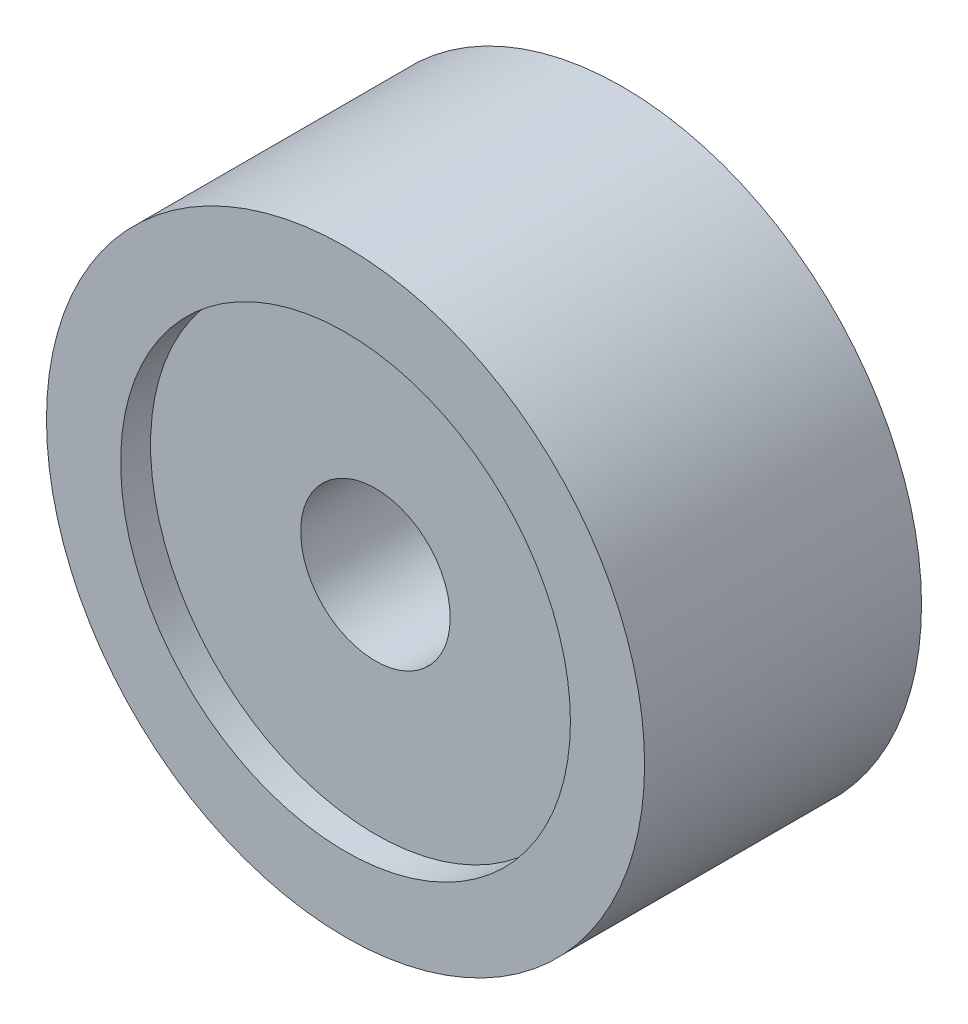
ISO-10303-21;
HEADER;
FILE_DESCRIPTION(('STEP AP214'),'2;1');
FILE_NAME('part.step','',(''),(''),'','','');
FILE_SCHEMA(('AUTOMOTIVE_DESIGN { 1 0 10303 214 1 1 1 1 }'));
ENDSEC;
DATA;
#1=APPLICATION_CONTEXT('core data for automotive mechanical design processes');
#2=APPLICATION_PROTOCOL_DEFINITION('international standard','automotive_design',2000,#1);
#3=PRODUCT_CONTEXT('',#1,'mechanical');
#4=PRODUCT('Part','Part','',(#3));
#5=PRODUCT_RELATED_PRODUCT_CATEGORY('part','',(#4));
#6=PRODUCT_DEFINITION_FORMATION('','',#4);
#7=PRODUCT_DEFINITION_CONTEXT('part definition',#1,'design');
#8=PRODUCT_DEFINITION('design','',#6,#7);
#9=PRODUCT_DEFINITION_SHAPE('','',#8);
#10=(LENGTH_UNIT() NAMED_UNIT(*) SI_UNIT(.MILLI.,.METRE.));
#11=(NAMED_UNIT(*) PLANE_ANGLE_UNIT() SI_UNIT($,.RADIAN.));
#12=(NAMED_UNIT(*) SI_UNIT($,.STERADIAN.) SOLID_ANGLE_UNIT());
#13=UNCERTAINTY_MEASURE_WITH_UNIT(LENGTH_MEASURE(1.E-05),#10,'distance_accuracy_value','');
#14=(GEOMETRIC_REPRESENTATION_CONTEXT(3) GLOBAL_UNCERTAINTY_ASSIGNED_CONTEXT((#13)) GLOBAL_UNIT_ASSIGNED_CONTEXT((#10,
#11,#12)) REPRESENTATION_CONTEXT('',''));
#15=CARTESIAN_POINT('',(0.,0.,0.));
#16=DIRECTION('',(0.,0.,1.));
#17=DIRECTION('',(1.,0.,0.));
#18=AXIS2_PLACEMENT_3D('',#15,#16,#17);
#19=CARTESIAN_POINT('',(0.,0.,-11.7602));
#20=DIRECTION('',(0.,0.,1.));
#21=DIRECTION('',(1.,0.,0.));
#22=AXIS2_PLACEMENT_3D('',#19,#20,#21);
#23=CYLINDRICAL_SURFACE('',#22,3.175);
#24=CARTESIAN_POINT('',(0.,0.,-11.7602));
#25=DIRECTION('',(0.,0.,1.));
#26=DIRECTION('',(1.,0.,0.));
#27=AXIS2_PLACEMENT_3D('',#24,#25,#26);
#28=CIRCLE('',#27,3.175);
#29=CARTESIAN_POINT('',(3.175,0.,-11.7602));
#30=VERTEX_POINT('',#29);
#31=EDGE_CURVE('E44',#30,#30,#28,.T.);
#32=CARTESIAN_POINT('',(0.,0.,-1.27));
#33=DIRECTION('',(0.,0.,1.));
#34=DIRECTION('',(1.,0.,0.));
#35=AXIS2_PLACEMENT_3D('',#32,#33,#34);
#36=CIRCLE('',#35,3.175);
#37=CARTESIAN_POINT('',(3.175,0.,-1.27));
#38=VERTEX_POINT('',#37);
#39=EDGE_CURVE('E35',#38,#38,#36,.F.);
#40=CARTESIAN_POINT('',(3.175,0.,-11.7602));
#41=CARTESIAN_POINT('',(3.175,0.,-11.6509270833333));
#42=CARTESIAN_POINT('',(3.175,0.,-11.5416541666667));
#43=CARTESIAN_POINT('',(3.175,0.,-11.3231083333333));
#44=CARTESIAN_POINT('',(3.175,0.,-11.2138354166667));
#45=CARTESIAN_POINT('',(3.175,0.,-10.9952895833333));
#46=CARTESIAN_POINT('',(3.175,0.,-10.8860166666667));
#47=CARTESIAN_POINT('',(3.175,0.,-10.6674708333333));
#48=CARTESIAN_POINT('',(3.175,0.,-10.5581979166667));
#49=CARTESIAN_POINT('',(3.175,0.,-10.3396520833333));
#50=CARTESIAN_POINT('',(3.175,0.,-10.2303791666667));
#51=CARTESIAN_POINT('',(3.175,0.,-10.0118333333333));
#52=CARTESIAN_POINT('',(3.175,0.,-9.90256041666667));
#53=CARTESIAN_POINT('',(3.175,0.,-9.68401458333333));
#54=CARTESIAN_POINT('',(3.175,0.,-9.57474166666667));
#55=CARTESIAN_POINT('',(3.175,0.,-9.35619583333333));
#56=CARTESIAN_POINT('',(3.175,0.,-9.24692291666667));
#57=CARTESIAN_POINT('',(3.175,0.,-9.02837708333333));
#58=CARTESIAN_POINT('',(3.175,0.,-8.91910416666667));
#59=CARTESIAN_POINT('',(3.175,0.,-8.70055833333333));
#60=CARTESIAN_POINT('',(3.175,0.,-8.59128541666667));
#61=CARTESIAN_POINT('',(3.175,0.,-8.37273958333333));
#62=CARTESIAN_POINT('',(3.175,0.,-8.26346666666667));
#63=CARTESIAN_POINT('',(3.175,0.,-8.04492083333333));
#64=CARTESIAN_POINT('',(3.175,0.,-7.93564791666667));
#65=CARTESIAN_POINT('',(3.175,0.,-7.71710208333333));
#66=CARTESIAN_POINT('',(3.175,0.,-7.60782916666667));
#67=CARTESIAN_POINT('',(3.175,0.,-7.38928333333333));
#68=CARTESIAN_POINT('',(3.175,0.,-7.28001041666667));
#69=CARTESIAN_POINT('',(3.175,0.,-7.06146458333333));
#70=CARTESIAN_POINT('',(3.175,0.,-6.95219166666667));
#71=CARTESIAN_POINT('',(3.175,0.,-6.73364583333333));
#72=CARTESIAN_POINT('',(3.175,0.,-6.62437291666667));
#73=CARTESIAN_POINT('',(3.175,0.,-6.40582708333333));
#74=CARTESIAN_POINT('',(3.175,0.,-6.29655416666667));
#75=CARTESIAN_POINT('',(3.175,0.,-6.07800833333333));
#76=CARTESIAN_POINT('',(3.175,0.,-5.96873541666667));
#77=CARTESIAN_POINT('',(3.175,0.,-5.75018958333333));
#78=CARTESIAN_POINT('',(3.175,0.,-5.64091666666667));
#79=CARTESIAN_POINT('',(3.175,0.,-5.42237083333333));
#80=CARTESIAN_POINT('',(3.175,0.,-5.31309791666667));
#81=CARTESIAN_POINT('',(3.175,0.,-5.09455208333333));
#82=CARTESIAN_POINT('',(3.175,0.,-4.98527916666667));
#83=CARTESIAN_POINT('',(3.175,0.,-4.76673333333333));
#84=CARTESIAN_POINT('',(3.175,0.,-4.65746041666667));
#85=CARTESIAN_POINT('',(3.175,0.,-4.43891458333333));
#86=CARTESIAN_POINT('',(3.175,0.,-4.32964166666667));
#87=CARTESIAN_POINT('',(3.175,0.,-4.11109583333333));
#88=CARTESIAN_POINT('',(3.175,0.,-4.00182291666667));
#89=CARTESIAN_POINT('',(3.175,0.,-3.78327708333333));
#90=CARTESIAN_POINT('',(3.175,0.,-3.67400416666667));
#91=CARTESIAN_POINT('',(3.175,0.,-3.45545833333333));
#92=CARTESIAN_POINT('',(3.175,0.,-3.34618541666667));
#93=CARTESIAN_POINT('',(3.175,0.,-3.12763958333333));
#94=CARTESIAN_POINT('',(3.175,0.,-3.01836666666667));
#95=CARTESIAN_POINT('',(3.175,0.,-2.79982083333333));
#96=CARTESIAN_POINT('',(3.175,0.,-2.69054791666667));
#97=CARTESIAN_POINT('',(3.175,0.,-2.47200208333333));
#98=CARTESIAN_POINT('',(3.175,0.,-2.36272916666667));
#99=CARTESIAN_POINT('',(3.175,0.,-2.14418333333333));
#100=CARTESIAN_POINT('',(3.175,0.,-2.03491041666667));
#101=CARTESIAN_POINT('',(3.175,0.,-1.81636458333333));
#102=CARTESIAN_POINT('',(3.175,0.,-1.70709166666667));
#103=CARTESIAN_POINT('',(3.175,0.,-1.48854583333333));
#104=CARTESIAN_POINT('',(3.175,0.,-1.37927291666667));
#105=CARTESIAN_POINT('',(3.175,0.,-1.27));
#106=B_SPLINE_CURVE_WITH_KNOTS('',3,(#40,#41,#42,#43,#44,#45,#46,#47,#48,#49,#50,#51,#52,#53,
#54,#55,#56,#57,#58,#59,#60,#61,#62,#63,#64,#65,#66,#67,#68,#69,#70,#71,#72,#73,#74,#75,#76,#77,
#78,#79,#80,#81,#82,#83,#84,#85,#86,#87,#88,#89,#90,#91,#92,#93,#94,#95,#96,#97,#98,#99,#100,
#101,#102,#103,#104,#105),.UNSPECIFIED.,.F.,.F.,(4,2,2,2,2,2,2,2,2,2,2,2,2,2,2,2,2,2,2,2,2,2,2,
2,2,2,2,2,2,2,2,2,4),(0.,0.32781875,0.6556375,0.98345625,1.311275,1.63909375,1.9669125,
2.29473125,2.62255,2.95036875,3.2781875,3.60600625,3.933825,4.26164375,4.5894625,4.91728125,
5.2451,5.57291875,5.9007375,6.22855625,6.556375,6.88419375,7.2120125,7.53983125,7.86765,
8.19546875,8.5232875,8.85110625,9.178925,9.50674375,9.8345625,10.16238125,10.4902),.UNSPECIFIED.);
#107=EDGE_CURVE('BSEAM31',#30,#38,#106,.T.);
#108=ORIENTED_EDGE('',*,*,#31,.F.);
#109=ORIENTED_EDGE('',*,*,#39,.F.);
#110=ORIENTED_EDGE('',*,*,#107,.T.);
#111=ORIENTED_EDGE('',*,*,#107,.F.);
#112=EDGE_LOOP('',(#108,#110,#109,#111));
#113=FACE_BOUND('',#112,.T.);
#114=ADVANCED_FACE('F31',(#113),#23,.F.);
#115=CARTESIAN_POINT('',(0.,0.,-11.7602));
#116=DIRECTION('',(0.,0.,1.));
#117=DIRECTION('',(1.,0.,0.));
#118=AXIS2_PLACEMENT_3D('',#115,#116,#117);
#119=CYLINDRICAL_SURFACE('',#118,12.7);
#120=CARTESIAN_POINT('',(0.,0.,-11.7602));
#121=DIRECTION('',(0.,0.,1.));
#122=DIRECTION('',(1.,0.,0.));
#123=AXIS2_PLACEMENT_3D('',#120,#121,#122);
#124=CIRCLE('',#123,12.7);
#125=CARTESIAN_POINT('',(12.7,0.,-11.7602));
#126=VERTEX_POINT('',#125);
#127=EDGE_CURVE('E10',#126,#126,#124,.T.);
#128=CARTESIAN_POINT('',(0.,0.,0.));
#129=DIRECTION('',(0.,0.,1.));
#130=DIRECTION('',(1.,0.,0.));
#131=AXIS2_PLACEMENT_3D('',#128,#129,#130);
#132=CIRCLE('',#131,12.7);
#133=CARTESIAN_POINT('',(12.7,0.,0.));
#134=VERTEX_POINT('',#133);
#135=EDGE_CURVE('E39',#134,#134,#132,.T.);
#136=CARTESIAN_POINT('',(12.7,0.,-11.7602));
#137=CARTESIAN_POINT('',(12.7,0.,-11.6376979166667));
#138=CARTESIAN_POINT('',(12.7,0.,-11.5151958333333));
#139=CARTESIAN_POINT('',(12.7,0.,-11.2701916666667));
#140=CARTESIAN_POINT('',(12.7,0.,-11.1476895833333));
#141=CARTESIAN_POINT('',(12.7,0.,-10.9026854166667));
#142=CARTESIAN_POINT('',(12.7,0.,-10.7801833333333));
#143=CARTESIAN_POINT('',(12.7,0.,-10.5351791666667));
#144=CARTESIAN_POINT('',(12.7,0.,-10.4126770833333));
#145=CARTESIAN_POINT('',(12.7,0.,-10.1676729166667));
#146=CARTESIAN_POINT('',(12.7,0.,-10.0451708333333));
#147=CARTESIAN_POINT('',(12.7,0.,-9.80016666666667));
#148=CARTESIAN_POINT('',(12.7,0.,-9.67766458333333));
#149=CARTESIAN_POINT('',(12.7,0.,-9.43266041666667));
#150=CARTESIAN_POINT('',(12.7,0.,-9.31015833333333));
#151=CARTESIAN_POINT('',(12.7,0.,-9.06515416666667));
#152=CARTESIAN_POINT('',(12.7,0.,-8.94265208333333));
#153=CARTESIAN_POINT('',(12.7,0.,-8.69764791666667));
#154=CARTESIAN_POINT('',(12.7,0.,-8.57514583333333));
#155=CARTESIAN_POINT('',(12.7,0.,-8.33014166666667));
#156=CARTESIAN_POINT('',(12.7,0.,-8.20763958333333));
#157=CARTESIAN_POINT('',(12.7,0.,-7.96263541666667));
#158=CARTESIAN_POINT('',(12.7,0.,-7.84013333333333));
#159=CARTESIAN_POINT('',(12.7,0.,-7.59512916666667));
#160=CARTESIAN_POINT('',(12.7,0.,-7.47262708333333));
#161=CARTESIAN_POINT('',(12.7,0.,-7.22762291666667));
#162=CARTESIAN_POINT('',(12.7,0.,-7.10512083333333));
#163=CARTESIAN_POINT('',(12.7,0.,-6.86011666666667));
#164=CARTESIAN_POINT('',(12.7,0.,-6.73761458333333));
#165=CARTESIAN_POINT('',(12.7,0.,-6.49261041666667));
#166=CARTESIAN_POINT('',(12.7,0.,-6.37010833333333));
#167=CARTESIAN_POINT('',(12.7,0.,-6.12510416666667));
#168=CARTESIAN_POINT('',(12.7,0.,-6.00260208333333));
#169=CARTESIAN_POINT('',(12.7,0.,-5.75759791666667));
#170=CARTESIAN_POINT('',(12.7,0.,-5.63509583333333));
#171=CARTESIAN_POINT('',(12.7,0.,-5.39009166666667));
#172=CARTESIAN_POINT('',(12.7,0.,-5.26758958333333));
#173=CARTESIAN_POINT('',(12.7,0.,-5.02258541666667));
#174=CARTESIAN_POINT('',(12.7,0.,-4.90008333333333));
#175=CARTESIAN_POINT('',(12.7,0.,-4.65507916666667));
#176=CARTESIAN_POINT('',(12.7,0.,-4.53257708333333));
#177=CARTESIAN_POINT('',(12.7,0.,-4.28757291666667));
#178=CARTESIAN_POINT('',(12.7,0.,-4.16507083333333));
#179=CARTESIAN_POINT('',(12.7,0.,-3.92006666666667));
#180=CARTESIAN_POINT('',(12.7,0.,-3.79756458333333));
#181=CARTESIAN_POINT('',(12.7,0.,-3.55256041666667));
#182=CARTESIAN_POINT('',(12.7,0.,-3.43005833333333));
#183=CARTESIAN_POINT('',(12.7,0.,-3.18505416666667));
#184=CARTESIAN_POINT('',(12.7,0.,-3.06255208333333));
#185=CARTESIAN_POINT('',(12.7,0.,-2.81754791666667));
#186=CARTESIAN_POINT('',(12.7,0.,-2.69504583333333));
#187=CARTESIAN_POINT('',(12.7,0.,-2.45004166666667));
#188=CARTESIAN_POINT('',(12.7,0.,-2.32753958333333));
#189=CARTESIAN_POINT('',(12.7,0.,-2.08253541666667));
#190=CARTESIAN_POINT('',(12.7,0.,-1.96003333333333));
#191=CARTESIAN_POINT('',(12.7,0.,-1.71502916666667));
#192=CARTESIAN_POINT('',(12.7,0.,-1.59252708333333));
#193=CARTESIAN_POINT('',(12.7,0.,-1.34752291666667));
#194=CARTESIAN_POINT('',(12.7,0.,-1.22502083333333));
#195=CARTESIAN_POINT('',(12.7,0.,-0.980016666666667));
#196=CARTESIAN_POINT('',(12.7,0.,-0.857514583333333));
#197=CARTESIAN_POINT('',(12.7,0.,-0.612510416666667));
#198=CARTESIAN_POINT('',(12.7,0.,-0.490008333333333));
#199=CARTESIAN_POINT('',(12.7,0.,-0.245004166666667));
#200=CARTESIAN_POINT('',(12.7,0.,-0.122502083333333));
#201=CARTESIAN_POINT('',(12.7,0.,0.));
#202=B_SPLINE_CURVE_WITH_KNOTS('',3,(#136,#137,#138,#139,#140,#141,#142,#143,#144,#145,#146,
#147,#148,#149,#150,#151,#152,#153,#154,#155,#156,#157,#158,#159,#160,#161,#162,#163,#164,#165,
#166,#167,#168,#169,#170,#171,#172,#173,#174,#175,#176,#177,#178,#179,#180,#181,#182,#183,#184,
#185,#186,#187,#188,#189,#190,#191,#192,#193,#194,#195,#196,#197,#198,#199,#200,#201),
.UNSPECIFIED.,.F.,.F.,(4,2,2,2,2,2,2,2,2,2,2,2,2,2,2,2,2,2,2,2,2,2,2,2,2,2,2,2,2,2,2,2,4),(0.,
0.367506250000002,0.735012500000002,1.10251875,1.470025,1.83753125,2.2050375,2.57254375,2.94005,
3.30755625,3.6750625,4.04256875,4.410075,4.77758125,5.1450875,5.51259375,5.8801,6.24760625,
6.6151125,6.98261875,7.350125,7.71763125,8.0851375,8.45264375,8.82015,9.18765625,9.5551625,
9.92266875,10.290175,10.65768125,11.0251875,11.39269375,11.7602),.UNSPECIFIED.);
#203=EDGE_CURVE('BSEAM33',#126,#134,#202,.T.);
#204=ORIENTED_EDGE('',*,*,#127,.T.);
#205=ORIENTED_EDGE('',*,*,#135,.F.);
#206=ORIENTED_EDGE('',*,*,#203,.T.);
#207=ORIENTED_EDGE('',*,*,#203,.F.);
#208=EDGE_LOOP('',(#204,#206,#205,#207));
#209=FACE_BOUND('',#208,.T.);
#210=ADVANCED_FACE('F33',(#209),#119,.T.);
#211=CARTESIAN_POINT('',(0.,0.,-11.7602));
#212=DIRECTION('',(0.,0.,1.));
#213=DIRECTION('',(1.,0.,0.));
#214=AXIS2_PLACEMENT_3D('',#211,#212,#213);
#215=PLANE('',#214);
#216=ORIENTED_EDGE('',*,*,#31,.T.);
#217=EDGE_LOOP('',(#216));
#218=FACE_BOUND('',#217,.T.);
#219=ORIENTED_EDGE('',*,*,#127,.F.);
#220=EDGE_LOOP('',(#219));
#221=FACE_BOUND('',#220,.T.);
#222=ADVANCED_FACE('F68',(#218,#221),#215,.F.);
#223=CARTESIAN_POINT('',(0.,0.,0.));
#224=DIRECTION('',(0.,0.,1.));
#225=DIRECTION('',(1.,0.,0.));
#226=AXIS2_PLACEMENT_3D('',#223,#224,#225);
#227=PLANE('',#226);
#228=CARTESIAN_POINT('',(0.,0.,0.));
#229=DIRECTION('',(0.,0.,1.));
#230=DIRECTION('',(1.,0.,0.));
#231=AXIS2_PLACEMENT_3D('',#228,#229,#230);
#232=CIRCLE('',#231,9.55);
#233=CARTESIAN_POINT('',(9.55,0.,0.));
#234=VERTEX_POINT('',#233);
#235=EDGE_CURVE('E48',#234,#234,#232,.T.);
#236=ORIENTED_EDGE('',*,*,#235,.F.);
#237=EDGE_LOOP('',(#236));
#238=FACE_BOUND('',#237,.T.);
#239=ORIENTED_EDGE('',*,*,#135,.T.);
#240=EDGE_LOOP('',(#239));
#241=FACE_BOUND('',#240,.T.);
#242=ADVANCED_FACE('F75',(#238,#241),#227,.T.);
#243=CARTESIAN_POINT('',(0.,0.,-1.27));
#244=DIRECTION('',(0.,0.,1.));
#245=DIRECTION('',(1.,0.,0.));
#246=AXIS2_PLACEMENT_3D('',#243,#244,#245);
#247=PLANE('',#246);
#248=CARTESIAN_POINT('',(0.,0.,-1.27));
#249=DIRECTION('',(0.,0.,1.));
#250=DIRECTION('',(1.,0.,0.));
#251=AXIS2_PLACEMENT_3D('',#248,#249,#250);
#252=CIRCLE('',#251,9.55);
#253=CARTESIAN_POINT('',(9.55,0.,-1.27));
#254=VERTEX_POINT('',#253);
#255=EDGE_CURVE('E51',#254,#254,#252,.T.);
#256=ORIENTED_EDGE('',*,*,#255,.T.);
#257=EDGE_LOOP('',(#256));
#258=FACE_BOUND('',#257,.T.);
#259=ORIENTED_EDGE('',*,*,#39,.T.);
#260=EDGE_LOOP('',(#259));
#261=FACE_BOUND('',#260,.T.);
#262=ADVANCED_FACE('F58',(#258,#261),#247,.T.);
#263=CARTESIAN_POINT('',(0.,0.,-1.27));
#264=DIRECTION('',(0.,0.,1.));
#265=DIRECTION('',(1.,0.,0.));
#266=AXIS2_PLACEMENT_3D('',#263,#264,#265);
#267=CYLINDRICAL_SURFACE('',#266,9.55);
#268=ORIENTED_EDGE('',*,*,#255,.F.);
#269=EDGE_LOOP('',(#268));
#270=FACE_BOUND('',#269,.T.);
#271=ORIENTED_EDGE('',*,*,#235,.T.);
#272=EDGE_LOOP('',(#271));
#273=FACE_BOUND('',#272,.T.);
#274=ADVANCED_FACE('F72',(#270,#273),#267,.F.);
#275=CLOSED_SHELL('',(#114,#210,#222,#242,#262,#274));
#276=MANIFOLD_SOLID_BREP('B2',#275);
#277=ADVANCED_BREP_SHAPE_REPRESENTATION('',(#18,#276),#14);
#278=SHAPE_DEFINITION_REPRESENTATION(#9,#277);
ENDSEC;
END-ISO-10303-21;
